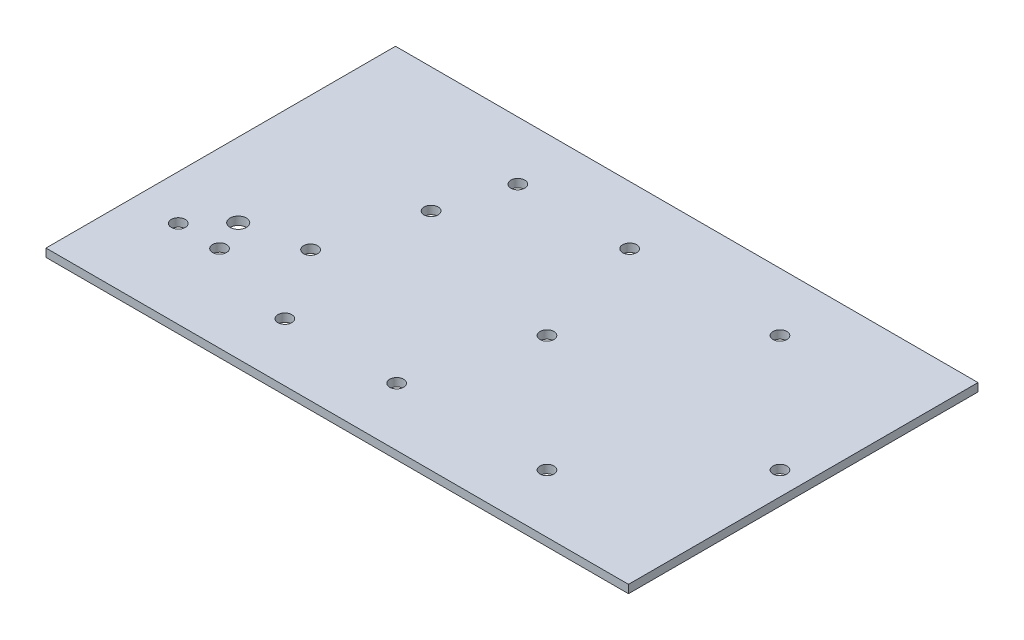
ISO-10303-21;
HEADER;
FILE_DESCRIPTION(('STEP AP214'),'2;1');
FILE_NAME('part.step','',(''),(''),'','','');
FILE_SCHEMA(('AUTOMOTIVE_DESIGN { 1 0 10303 214 1 1 1 1 }'));
ENDSEC;
DATA;
#1=APPLICATION_CONTEXT('core data for automotive mechanical design processes');
#2=APPLICATION_PROTOCOL_DEFINITION('international standard','automotive_design',2000,#1);
#3=PRODUCT_CONTEXT('',#1,'mechanical');
#4=PRODUCT('Part','Part','',(#3));
#5=PRODUCT_RELATED_PRODUCT_CATEGORY('part','',(#4));
#6=PRODUCT_DEFINITION_FORMATION('','',#4);
#7=PRODUCT_DEFINITION_CONTEXT('part definition',#1,'design');
#8=PRODUCT_DEFINITION('design','',#6,#7);
#9=PRODUCT_DEFINITION_SHAPE('','',#8);
#10=(LENGTH_UNIT() NAMED_UNIT(*) SI_UNIT(.MILLI.,.METRE.));
#11=(NAMED_UNIT(*) PLANE_ANGLE_UNIT() SI_UNIT($,.RADIAN.));
#12=(NAMED_UNIT(*) SI_UNIT($,.STERADIAN.) SOLID_ANGLE_UNIT());
#13=UNCERTAINTY_MEASURE_WITH_UNIT(LENGTH_MEASURE(1.E-05),#10,'distance_accuracy_value','');
#14=(GEOMETRIC_REPRESENTATION_CONTEXT(3) GLOBAL_UNCERTAINTY_ASSIGNED_CONTEXT((#13)) GLOBAL_UNIT_ASSIGNED_CONTEXT((#10,
#11,#12)) REPRESENTATION_CONTEXT('',''));
#15=CARTESIAN_POINT('',(0.,0.,0.));
#16=DIRECTION('',(0.,0.,1.));
#17=DIRECTION('',(1.,0.,0.));
#18=AXIS2_PLACEMENT_3D('',#15,#16,#17);
#19=CARTESIAN_POINT('',(-190.,-5.,-75.));
#20=DIRECTION('',(-1.,0.,0.));
#21=DIRECTION('',(0.,0.,1.));
#22=AXIS2_PLACEMENT_3D('',#19,#20,#21);
#23=PLANE('',#22);
#24=DIRECTION('',(0.,1.,0.));
#25=VECTOR('',#24,1.);
#26=CARTESIAN_POINT('',(-190.,-5.,75.));
#27=LINE('',#26,#25);
#28=CARTESIAN_POINT('',(-190.,-5.,75.));
#29=VERTEX_POINT('',#28);
#30=CARTESIAN_POINT('',(-190.,-1.5,75.));
#31=VERTEX_POINT('',#30);
#32=EDGE_CURVE('E38',#29,#31,#27,.T.);
#33=ORIENTED_EDGE('',*,*,#32,.T.);
#34=DIRECTION('',(0.,0.,1.));
#35=VECTOR('',#34,1.);
#36=CARTESIAN_POINT('',(-190.,-1.5,-75.));
#37=LINE('',#36,#35);
#38=CARTESIAN_POINT('',(-190.,-1.5,-75.));
#39=VERTEX_POINT('',#38);
#40=EDGE_CURVE('E51',#39,#31,#37,.T.);
#41=ORIENTED_EDGE('',*,*,#40,.F.);
#42=DIRECTION('',(0.,1.,0.));
#43=VECTOR('',#42,1.);
#44=CARTESIAN_POINT('',(-190.,-5.,-75.));
#45=LINE('',#44,#43);
#46=CARTESIAN_POINT('',(-190.,-5.,-75.));
#47=VERTEX_POINT('',#46);
#48=EDGE_CURVE('E11',#47,#39,#45,.T.);
#49=ORIENTED_EDGE('',*,*,#48,.F.);
#50=DIRECTION('',(0.,0.,1.));
#51=VECTOR('',#50,1.);
#52=CARTESIAN_POINT('',(-190.,-5.,-75.));
#53=LINE('',#52,#51);
#54=EDGE_CURVE('E94',#47,#29,#53,.T.);
#55=ORIENTED_EDGE('',*,*,#54,.T.);
#56=EDGE_LOOP('',(#33,#41,#49,#55));
#57=FACE_BOUND('',#56,.T.);
#58=ADVANCED_FACE('F35',(#57),#23,.T.);
#59=CARTESIAN_POINT('',(-190.,-5.,-75.));
#60=DIRECTION('',(0.,0.,1.));
#61=DIRECTION('',(1.,0.,0.));
#62=AXIS2_PLACEMENT_3D('',#59,#60,#61);
#63=PLANE('',#62);
#64=DIRECTION('',(-1.,0.,0.));
#65=VECTOR('',#64,1.);
#66=CARTESIAN_POINT('',(60.,-1.5,-75.));
#67=LINE('',#66,#65);
#68=CARTESIAN_POINT('',(60.,-1.5,-75.));
#69=VERTEX_POINT('',#68);
#70=EDGE_CURVE('E74',#69,#39,#67,.T.);
#71=ORIENTED_EDGE('',*,*,#70,.F.);
#72=DIRECTION('',(0.,1.,0.));
#73=VECTOR('',#72,1.);
#74=CARTESIAN_POINT('',(60.,-5.,-75.));
#75=LINE('',#74,#73);
#76=CARTESIAN_POINT('',(60.,-5.,-75.));
#77=VERTEX_POINT('',#76);
#78=EDGE_CURVE('E43',#77,#69,#75,.T.);
#79=ORIENTED_EDGE('',*,*,#78,.F.);
#80=DIRECTION('',(1.,0.,0.));
#81=VECTOR('',#80,1.);
#82=CARTESIAN_POINT('',(-190.,-5.,-75.));
#83=LINE('',#82,#81);
#84=EDGE_CURVE('E87',#47,#77,#83,.T.);
#85=ORIENTED_EDGE('',*,*,#84,.F.);
#86=ORIENTED_EDGE('',*,*,#48,.T.);
#87=EDGE_LOOP('',(#71,#79,#85,#86));
#88=FACE_BOUND('',#87,.T.);
#89=ADVANCED_FACE('F86',(#88),#63,.F.);
#90=CARTESIAN_POINT('',(60.,-5.,-75.));
#91=DIRECTION('',(-1.,0.,0.));
#92=DIRECTION('',(0.,0.,1.));
#93=AXIS2_PLACEMENT_3D('',#90,#91,#92);
#94=PLANE('',#93);
#95=DIRECTION('',(0.,0.,-1.));
#96=VECTOR('',#95,1.);
#97=CARTESIAN_POINT('',(60.,-1.5,75.));
#98=LINE('',#97,#96);
#99=CARTESIAN_POINT('',(60.,-1.5,75.));
#100=VERTEX_POINT('',#99);
#101=EDGE_CURVE('E77',#100,#69,#98,.T.);
#102=ORIENTED_EDGE('',*,*,#101,.F.);
#103=DIRECTION('',(0.,1.,0.));
#104=VECTOR('',#103,1.);
#105=CARTESIAN_POINT('',(60.,-5.,75.));
#106=LINE('',#105,#104);
#107=CARTESIAN_POINT('',(60.,-5.,75.));
#108=VERTEX_POINT('',#107);
#109=EDGE_CURVE('E107',#108,#100,#106,.T.);
#110=ORIENTED_EDGE('',*,*,#109,.F.);
#111=DIRECTION('',(0.,0.,1.));
#112=VECTOR('',#111,1.);
#113=CARTESIAN_POINT('',(60.,-5.,-75.));
#114=LINE('',#113,#112);
#115=EDGE_CURVE('E91',#77,#108,#114,.T.);
#116=ORIENTED_EDGE('',*,*,#115,.F.);
#117=ORIENTED_EDGE('',*,*,#78,.T.);
#118=EDGE_LOOP('',(#102,#110,#116,#117));
#119=FACE_BOUND('',#118,.T.);
#120=ADVANCED_FACE('F113',(#119),#94,.F.);
#121=CARTESIAN_POINT('',(-190.,-5.,75.));
#122=DIRECTION('',(0.,0.,1.));
#123=DIRECTION('',(1.,0.,0.));
#124=AXIS2_PLACEMENT_3D('',#121,#122,#123);
#125=PLANE('',#124);
#126=ORIENTED_EDGE('',*,*,#109,.T.);
#127=DIRECTION('',(1.,0.,0.));
#128=VECTOR('',#127,1.);
#129=CARTESIAN_POINT('',(-190.,-1.5,75.));
#130=LINE('',#129,#128);
#131=EDGE_CURVE('E84',#31,#100,#130,.T.);
#132=ORIENTED_EDGE('',*,*,#131,.F.);
#133=ORIENTED_EDGE('',*,*,#32,.F.);
#134=DIRECTION('',(1.,0.,0.));
#135=VECTOR('',#134,1.);
#136=CARTESIAN_POINT('',(-190.,-5.,75.));
#137=LINE('',#136,#135);
#138=EDGE_CURVE('E97',#29,#108,#137,.T.);
#139=ORIENTED_EDGE('',*,*,#138,.T.);
#140=EDGE_LOOP('',(#126,#132,#133,#139));
#141=FACE_BOUND('',#140,.T.);
#142=ADVANCED_FACE('F111',(#141),#125,.T.);
#143=CARTESIAN_POINT('',(0.,-5.,-50.));
#144=DIRECTION('',(0.,1.,0.));
#145=DIRECTION('',(0.,0.,1.));
#146=AXIS2_PLACEMENT_3D('',#143,#144,#145);
#147=CYLINDRICAL_SURFACE('',#146,3.);
#148=CARTESIAN_POINT('',(0.,-5.,-50.));
#149=DIRECTION('',(0.,1.,0.));
#150=DIRECTION('',(0.,0.,1.));
#151=AXIS2_PLACEMENT_3D('',#148,#149,#150);
#152=CIRCLE('',#151,3.);
#153=CARTESIAN_POINT('',(0.,-5.,-47.));
#154=VERTEX_POINT('',#153);
#155=EDGE_CURVE('E98',#154,#154,#152,.T.);
#156=ORIENTED_EDGE('',*,*,#155,.F.);
#157=EDGE_LOOP('',(#156));
#158=FACE_BOUND('',#157,.T.);
#159=CARTESIAN_POINT('',(0.,-1.5,-50.));
#160=DIRECTION('',(0.,1.,0.));
#161=DIRECTION('',(0.,0.,1.));
#162=AXIS2_PLACEMENT_3D('',#159,#160,#161);
#163=CIRCLE('',#162,3.);
#164=CARTESIAN_POINT('',(0.,-1.5,-47.));
#165=VERTEX_POINT('',#164);
#166=EDGE_CURVE('E165',#165,#165,#163,.T.);
#167=ORIENTED_EDGE('',*,*,#166,.T.);
#168=EDGE_LOOP('',(#167));
#169=FACE_BOUND('',#168,.T.);
#170=ADVANCED_FACE('F152',(#158,#169),#147,.F.);
#171=CARTESIAN_POINT('',(-50.,-5.,0.));
#172=DIRECTION('',(0.,1.,0.));
#173=DIRECTION('',(0.,0.,1.));
#174=AXIS2_PLACEMENT_3D('',#171,#172,#173);
#175=CYLINDRICAL_SURFACE('',#174,3.);
#176=CARTESIAN_POINT('',(-50.,-5.,0.));
#177=DIRECTION('',(0.,1.,0.));
#178=DIRECTION('',(0.,0.,1.));
#179=AXIS2_PLACEMENT_3D('',#176,#177,#178);
#180=CIRCLE('',#179,3.);
#181=CARTESIAN_POINT('',(-50.,-5.,3.));
#182=VERTEX_POINT('',#181);
#183=EDGE_CURVE('E102',#182,#182,#180,.T.);
#184=ORIENTED_EDGE('',*,*,#183,.F.);
#185=EDGE_LOOP('',(#184));
#186=FACE_BOUND('',#185,.T.);
#187=CARTESIAN_POINT('',(-50.,-1.5,0.));
#188=DIRECTION('',(0.,1.,0.));
#189=DIRECTION('',(0.,0.,1.));
#190=AXIS2_PLACEMENT_3D('',#187,#188,#189);
#191=CIRCLE('',#190,3.);
#192=CARTESIAN_POINT('',(-50.,-1.5,3.));
#193=VERTEX_POINT('',#192);
#194=EDGE_CURVE('E156',#193,#193,#191,.T.);
#195=ORIENTED_EDGE('',*,*,#194,.T.);
#196=EDGE_LOOP('',(#195));
#197=FACE_BOUND('',#196,.T.);
#198=ADVANCED_FACE('F148',(#186,#197),#175,.F.);
#199=CARTESIAN_POINT('',(0.,-5.,50.));
#200=DIRECTION('',(0.,1.,0.));
#201=DIRECTION('',(0.,0.,1.));
#202=AXIS2_PLACEMENT_3D('',#199,#200,#201);
#203=CYLINDRICAL_SURFACE('',#202,3.);
#204=CARTESIAN_POINT('',(0.,-5.,50.));
#205=DIRECTION('',(0.,1.,0.));
#206=DIRECTION('',(0.,0.,1.));
#207=AXIS2_PLACEMENT_3D('',#204,#205,#206);
#208=CIRCLE('',#207,3.);
#209=CARTESIAN_POINT('',(0.,-5.,53.));
#210=VERTEX_POINT('',#209);
#211=EDGE_CURVE('E141',#210,#210,#208,.T.);
#212=ORIENTED_EDGE('',*,*,#211,.F.);
#213=EDGE_LOOP('',(#212));
#214=FACE_BOUND('',#213,.T.);
#215=CARTESIAN_POINT('',(0.,-1.5,50.));
#216=DIRECTION('',(0.,1.,0.));
#217=DIRECTION('',(0.,0.,1.));
#218=AXIS2_PLACEMENT_3D('',#215,#216,#217);
#219=CIRCLE('',#218,3.);
#220=CARTESIAN_POINT('',(0.,-1.5,53.));
#221=VERTEX_POINT('',#220);
#222=EDGE_CURVE('E291',#221,#221,#219,.T.);
#223=ORIENTED_EDGE('',*,*,#222,.T.);
#224=EDGE_LOOP('',(#223));
#225=FACE_BOUND('',#224,.T.);
#226=ADVANCED_FACE('F151',(#214,#225),#203,.F.);
#227=CARTESIAN_POINT('',(50.,-5.,0.));
#228=DIRECTION('',(0.,1.,0.));
#229=DIRECTION('',(0.,0.,1.));
#230=AXIS2_PLACEMENT_3D('',#227,#228,#229);
#231=CYLINDRICAL_SURFACE('',#230,3.);
#232=CARTESIAN_POINT('',(50.,-5.,0.));
#233=DIRECTION('',(0.,1.,0.));
#234=DIRECTION('',(0.,0.,1.));
#235=AXIS2_PLACEMENT_3D('',#232,#233,#234);
#236=CIRCLE('',#235,3.);
#237=CARTESIAN_POINT('',(50.,-5.,3.));
#238=VERTEX_POINT('',#237);
#239=EDGE_CURVE('E138',#238,#238,#236,.T.);
#240=ORIENTED_EDGE('',*,*,#239,.F.);
#241=EDGE_LOOP('',(#240));
#242=FACE_BOUND('',#241,.T.);
#243=CARTESIAN_POINT('',(50.,-1.5,0.));
#244=DIRECTION('',(0.,1.,0.));
#245=DIRECTION('',(0.,0.,1.));
#246=AXIS2_PLACEMENT_3D('',#243,#244,#245);
#247=CIRCLE('',#246,3.);
#248=CARTESIAN_POINT('',(50.,-1.5,3.));
#249=VERTEX_POINT('',#248);
#250=EDGE_CURVE('E293',#249,#249,#247,.T.);
#251=ORIENTED_EDGE('',*,*,#250,.T.);
#252=EDGE_LOOP('',(#251));
#253=FACE_BOUND('',#252,.T.);
#254=ADVANCED_FACE('F224',(#242,#253),#231,.F.);
#255=CARTESIAN_POINT('',(-170.76,-5.,37.46));
#256=DIRECTION('',(0.,1.,0.));
#257=DIRECTION('',(0.,0.,1.));
#258=AXIS2_PLACEMENT_3D('',#255,#256,#257);
#259=CYLINDRICAL_SURFACE('',#258,2.99999999999999);
#260=CARTESIAN_POINT('',(-170.76,-5.,37.46));
#261=DIRECTION('',(0.,1.,0.));
#262=DIRECTION('',(0.,0.,1.));
#263=AXIS2_PLACEMENT_3D('',#260,#261,#262);
#264=CIRCLE('',#263,2.99999999999999);
#265=CARTESIAN_POINT('',(-170.76,-5.,40.46));
#266=VERTEX_POINT('',#265);
#267=EDGE_CURVE('E135',#266,#266,#264,.T.);
#268=ORIENTED_EDGE('',*,*,#267,.F.);
#269=EDGE_LOOP('',(#268));
#270=FACE_BOUND('',#269,.T.);
#271=CARTESIAN_POINT('',(-170.76,-1.5,37.46));
#272=DIRECTION('',(0.,1.,0.));
#273=DIRECTION('',(0.,0.,1.));
#274=AXIS2_PLACEMENT_3D('',#271,#272,#273);
#275=CIRCLE('',#274,2.99999999999999);
#276=CARTESIAN_POINT('',(-170.76,-1.5,40.46));
#277=VERTEX_POINT('',#276);
#278=EDGE_CURVE('E81',#277,#277,#275,.T.);
#279=ORIENTED_EDGE('',*,*,#278,.T.);
#280=EDGE_LOOP('',(#279));
#281=FACE_BOUND('',#280,.T.);
#282=ADVANCED_FACE('F183',(#270,#281),#259,.F.);
#283=CARTESIAN_POINT('',(-152.57,-45.,37.93));
#284=DIRECTION('',(0.,1.,0.));
#285=DIRECTION('',(0.,0.,1.));
#286=AXIS2_PLACEMENT_3D('',#283,#284,#285);
#287=CYLINDRICAL_SURFACE('',#286,2.99999999999999);
#288=CARTESIAN_POINT('',(-152.57,-5.,37.93));
#289=DIRECTION('',(0.,1.,0.));
#290=DIRECTION('',(0.,0.,1.));
#291=AXIS2_PLACEMENT_3D('',#288,#289,#290);
#292=CIRCLE('',#291,2.99999999999999);
#293=CARTESIAN_POINT('',(-152.57,-5.,40.93));
#294=VERTEX_POINT('',#293);
#295=EDGE_CURVE('E132',#294,#294,#292,.T.);
#296=ORIENTED_EDGE('',*,*,#295,.F.);
#297=EDGE_LOOP('',(#296));
#298=FACE_BOUND('',#297,.T.);
#299=CARTESIAN_POINT('',(-152.57,-1.5,37.93));
#300=DIRECTION('',(0.,1.,0.));
#301=DIRECTION('',(0.,0.,1.));
#302=AXIS2_PLACEMENT_3D('',#299,#300,#301);
#303=CIRCLE('',#302,2.99999999999999);
#304=CARTESIAN_POINT('',(-152.57,-1.5,40.93));
#305=VERTEX_POINT('',#304);
#306=EDGE_CURVE('E174',#305,#305,#303,.T.);
#307=ORIENTED_EDGE('',*,*,#306,.T.);
#308=EDGE_LOOP('',(#307));
#309=FACE_BOUND('',#308,.T.);
#310=ADVANCED_FACE('F231',(#298,#309),#287,.F.);
#311=CARTESIAN_POINT('',(-158.16,-45.,24.34));
#312=DIRECTION('',(0.,1.,0.));
#313=DIRECTION('',(0.,0.,1.));
#314=AXIS2_PLACEMENT_3D('',#311,#312,#313);
#315=CYLINDRICAL_SURFACE('',#314,3.49999999999999);
#316=CARTESIAN_POINT('',(-158.16,-5.,24.34));
#317=DIRECTION('',(0.,1.,0.));
#318=DIRECTION('',(0.,0.,1.));
#319=AXIS2_PLACEMENT_3D('',#316,#317,#318);
#320=CIRCLE('',#319,3.49999999999999);
#321=CARTESIAN_POINT('',(-158.16,-5.,27.84));
#322=VERTEX_POINT('',#321);
#323=EDGE_CURVE('E129',#322,#322,#320,.T.);
#324=ORIENTED_EDGE('',*,*,#323,.F.);
#325=EDGE_LOOP('',(#324));
#326=FACE_BOUND('',#325,.T.);
#327=CARTESIAN_POINT('',(-158.16,-1.5,24.34));
#328=DIRECTION('',(0.,1.,0.));
#329=DIRECTION('',(0.,0.,1.));
#330=AXIS2_PLACEMENT_3D('',#327,#328,#329);
#331=CIRCLE('',#330,3.49999999999999);
#332=CARTESIAN_POINT('',(-158.16,-1.5,27.84));
#333=VERTEX_POINT('',#332);
#334=EDGE_CURVE('E177',#333,#333,#331,.T.);
#335=ORIENTED_EDGE('',*,*,#334,.T.);
#336=EDGE_LOOP('',(#335));
#337=FACE_BOUND('',#336,.T.);
#338=ADVANCED_FACE('F235',(#326,#337),#315,.F.);
#339=CARTESIAN_POINT('',(-112.5,-5.,50.));
#340=DIRECTION('',(0.,1.,0.));
#341=DIRECTION('',(0.,0.,1.));
#342=AXIS2_PLACEMENT_3D('',#339,#340,#341);
#343=CYLINDRICAL_SURFACE('',#342,3.00000000000001);
#344=CARTESIAN_POINT('',(-112.5,-5.,50.));
#345=DIRECTION('',(0.,1.,0.));
#346=DIRECTION('',(0.,0.,1.));
#347=AXIS2_PLACEMENT_3D('',#344,#345,#346);
#348=CIRCLE('',#347,3.00000000000001);
#349=CARTESIAN_POINT('',(-112.5,-5.,53.));
#350=VERTEX_POINT('',#349);
#351=EDGE_CURVE('E126',#350,#350,#348,.T.);
#352=ORIENTED_EDGE('',*,*,#351,.F.);
#353=EDGE_LOOP('',(#352));
#354=FACE_BOUND('',#353,.T.);
#355=CARTESIAN_POINT('',(-112.5,-1.5,50.));
#356=DIRECTION('',(0.,1.,0.));
#357=DIRECTION('',(0.,0.,1.));
#358=AXIS2_PLACEMENT_3D('',#355,#356,#357);
#359=CIRCLE('',#358,3.00000000000001);
#360=CARTESIAN_POINT('',(-112.5,-1.5,53.));
#361=VERTEX_POINT('',#360);
#362=EDGE_CURVE('E162',#361,#361,#359,.T.);
#363=ORIENTED_EDGE('',*,*,#362,.T.);
#364=EDGE_LOOP('',(#363));
#365=FACE_BOUND('',#364,.T.);
#366=ADVANCED_FACE('F239',(#354,#365),#343,.F.);
#367=CARTESIAN_POINT('',(-64.5,-5.,50.));
#368=DIRECTION('',(0.,1.,0.));
#369=DIRECTION('',(0.,0.,1.));
#370=AXIS2_PLACEMENT_3D('',#367,#368,#369);
#371=CYLINDRICAL_SURFACE('',#370,3.);
#372=CARTESIAN_POINT('',(-64.5,-5.,50.));
#373=DIRECTION('',(0.,1.,0.));
#374=DIRECTION('',(0.,0.,1.));
#375=AXIS2_PLACEMENT_3D('',#372,#373,#374);
#376=CIRCLE('',#375,3.);
#377=CARTESIAN_POINT('',(-64.5,-5.,53.));
#378=VERTEX_POINT('',#377);
#379=EDGE_CURVE('E123',#378,#378,#376,.T.);
#380=ORIENTED_EDGE('',*,*,#379,.F.);
#381=EDGE_LOOP('',(#380));
#382=FACE_BOUND('',#381,.T.);
#383=CARTESIAN_POINT('',(-64.5,-1.5,50.));
#384=DIRECTION('',(0.,1.,0.));
#385=DIRECTION('',(0.,0.,1.));
#386=AXIS2_PLACEMENT_3D('',#383,#384,#385);
#387=CIRCLE('',#386,3.);
#388=CARTESIAN_POINT('',(-64.5,-1.5,53.));
#389=VERTEX_POINT('',#388);
#390=EDGE_CURVE('E159',#389,#389,#387,.T.);
#391=ORIENTED_EDGE('',*,*,#390,.T.);
#392=EDGE_LOOP('',(#391));
#393=FACE_BOUND('',#392,.T.);
#394=ADVANCED_FACE('F243',(#382,#393),#371,.F.);
#395=CARTESIAN_POINT('',(-132.61,-5.,18.84));
#396=DIRECTION('',(0.,1.,0.));
#397=DIRECTION('',(0.,0.,1.));
#398=AXIS2_PLACEMENT_3D('',#395,#396,#397);
#399=CYLINDRICAL_SURFACE('',#398,2.99999999999999);
#400=CARTESIAN_POINT('',(-132.61,-5.,18.84));
#401=DIRECTION('',(0.,1.,0.));
#402=DIRECTION('',(0.,0.,1.));
#403=AXIS2_PLACEMENT_3D('',#400,#401,#402);
#404=CIRCLE('',#403,2.99999999999999);
#405=CARTESIAN_POINT('',(-132.61,-5.,21.84));
#406=VERTEX_POINT('',#405);
#407=EDGE_CURVE('E117',#406,#406,#404,.T.);
#408=ORIENTED_EDGE('',*,*,#407,.F.);
#409=EDGE_LOOP('',(#408));
#410=FACE_BOUND('',#409,.T.);
#411=CARTESIAN_POINT('',(-132.61,-1.5,18.84));
#412=DIRECTION('',(0.,1.,0.));
#413=DIRECTION('',(0.,0.,1.));
#414=AXIS2_PLACEMENT_3D('',#411,#412,#413);
#415=CIRCLE('',#414,2.99999999999999);
#416=CARTESIAN_POINT('',(-132.61,-1.5,21.84));
#417=VERTEX_POINT('',#416);
#418=EDGE_CURVE('E171',#417,#417,#415,.T.);
#419=ORIENTED_EDGE('',*,*,#418,.T.);
#420=EDGE_LOOP('',(#419));
#421=FACE_BOUND('',#420,.T.);
#422=ADVANCED_FACE('F247',(#410,#421),#399,.F.);
#423=CARTESIAN_POINT('',(-121.14,-5.,-21.42));
#424=DIRECTION('',(0.,1.,0.));
#425=DIRECTION('',(0.,0.,1.));
#426=AXIS2_PLACEMENT_3D('',#423,#424,#425);
#427=CYLINDRICAL_SURFACE('',#426,3.00000000000001);
#428=CARTESIAN_POINT('',(-121.14,-5.,-21.42));
#429=DIRECTION('',(0.,1.,0.));
#430=DIRECTION('',(0.,0.,1.));
#431=AXIS2_PLACEMENT_3D('',#428,#429,#430);
#432=CIRCLE('',#431,3.00000000000001);
#433=CARTESIAN_POINT('',(-121.14,-5.,-18.42));
#434=VERTEX_POINT('',#433);
#435=EDGE_CURVE('E114',#434,#434,#432,.T.);
#436=ORIENTED_EDGE('',*,*,#435,.F.);
#437=EDGE_LOOP('',(#436));
#438=FACE_BOUND('',#437,.T.);
#439=CARTESIAN_POINT('',(-121.14,-1.5,-21.42));
#440=DIRECTION('',(0.,1.,0.));
#441=DIRECTION('',(0.,0.,1.));
#442=AXIS2_PLACEMENT_3D('',#439,#440,#441);
#443=CIRCLE('',#442,3.00000000000001);
#444=CARTESIAN_POINT('',(-121.14,-1.5,-18.42));
#445=VERTEX_POINT('',#444);
#446=EDGE_CURVE('E158',#445,#445,#443,.T.);
#447=ORIENTED_EDGE('',*,*,#446,.T.);
#448=EDGE_LOOP('',(#447));
#449=FACE_BOUND('',#448,.T.);
#450=ADVANCED_FACE('F196',(#438,#449),#427,.F.);
#451=CARTESIAN_POINT('',(0.,-5.,0.));
#452=DIRECTION('',(0.,1.,0.));
#453=DIRECTION('',(0.,0.,1.));
#454=AXIS2_PLACEMENT_3D('',#451,#452,#453);
#455=PLANE('',#454);
#456=CARTESIAN_POINT('',(-112.5,-5.,-50.));
#457=DIRECTION('',(0.,1.,0.));
#458=DIRECTION('',(0.,0.,1.));
#459=AXIS2_PLACEMENT_3D('',#456,#457,#458);
#460=CIRCLE('',#459,3.00000000000001);
#461=CARTESIAN_POINT('',(-112.5,-5.,-47.));
#462=VERTEX_POINT('',#461);
#463=EDGE_CURVE('E303',#462,#462,#460,.T.);
#464=ORIENTED_EDGE('',*,*,#463,.T.);
#465=EDGE_LOOP('',(#464));
#466=FACE_BOUND('',#465,.T.);
#467=CARTESIAN_POINT('',(-64.5,-5.,-50.));
#468=DIRECTION('',(0.,1.,0.));
#469=DIRECTION('',(0.,0.,1.));
#470=AXIS2_PLACEMENT_3D('',#467,#468,#469);
#471=CIRCLE('',#470,3.);
#472=CARTESIAN_POINT('',(-64.5,-5.,-47.));
#473=VERTEX_POINT('',#472);
#474=EDGE_CURVE('E297',#473,#473,#471,.T.);
#475=ORIENTED_EDGE('',*,*,#474,.T.);
#476=EDGE_LOOP('',(#475));
#477=FACE_BOUND('',#476,.T.);
#478=ORIENTED_EDGE('',*,*,#435,.T.);
#479=EDGE_LOOP('',(#478));
#480=FACE_BOUND('',#479,.T.);
#481=ORIENTED_EDGE('',*,*,#407,.T.);
#482=EDGE_LOOP('',(#481));
#483=FACE_BOUND('',#482,.T.);
#484=ORIENTED_EDGE('',*,*,#379,.T.);
#485=EDGE_LOOP('',(#484));
#486=FACE_BOUND('',#485,.T.);
#487=ORIENTED_EDGE('',*,*,#351,.T.);
#488=EDGE_LOOP('',(#487));
#489=FACE_BOUND('',#488,.T.);
#490=ORIENTED_EDGE('',*,*,#323,.T.);
#491=EDGE_LOOP('',(#490));
#492=FACE_BOUND('',#491,.T.);
#493=ORIENTED_EDGE('',*,*,#295,.T.);
#494=EDGE_LOOP('',(#493));
#495=FACE_BOUND('',#494,.T.);
#496=ORIENTED_EDGE('',*,*,#267,.T.);
#497=EDGE_LOOP('',(#496));
#498=FACE_BOUND('',#497,.T.);
#499=ORIENTED_EDGE('',*,*,#239,.T.);
#500=EDGE_LOOP('',(#499));
#501=FACE_BOUND('',#500,.T.);
#502=ORIENTED_EDGE('',*,*,#211,.T.);
#503=EDGE_LOOP('',(#502));
#504=FACE_BOUND('',#503,.T.);
#505=ORIENTED_EDGE('',*,*,#183,.T.);
#506=EDGE_LOOP('',(#505));
#507=FACE_BOUND('',#506,.T.);
#508=ORIENTED_EDGE('',*,*,#155,.T.);
#509=EDGE_LOOP('',(#508));
#510=FACE_BOUND('',#509,.T.);
#511=ORIENTED_EDGE('',*,*,#54,.F.);
#512=ORIENTED_EDGE('',*,*,#84,.T.);
#513=ORIENTED_EDGE('',*,*,#115,.T.);
#514=ORIENTED_EDGE('',*,*,#138,.F.);
#515=EDGE_LOOP('',(#511,#512,#513,#514));
#516=FACE_BOUND('',#515,.T.);
#517=ADVANCED_FACE('F95',(#466,#477,#480,#483,#486,#489,#492,#495,#498,#501,#504,#507,#510,
#516),#455,.F.);
#518=CARTESIAN_POINT('',(0.,-1.5,0.));
#519=DIRECTION('',(0.,1.,0.));
#520=DIRECTION('',(0.,0.,1.));
#521=AXIS2_PLACEMENT_3D('',#518,#519,#520);
#522=PLANE('',#521);
#523=CARTESIAN_POINT('',(-112.5,-1.5,-50.));
#524=DIRECTION('',(0.,1.,0.));
#525=DIRECTION('',(0.,0.,1.));
#526=AXIS2_PLACEMENT_3D('',#523,#524,#525);
#527=CIRCLE('',#526,3.00000000000001);
#528=CARTESIAN_POINT('',(-112.5,-1.5,-47.));
#529=VERTEX_POINT('',#528);
#530=EDGE_CURVE('E306',#529,#529,#527,.T.);
#531=ORIENTED_EDGE('',*,*,#530,.F.);
#532=EDGE_LOOP('',(#531));
#533=FACE_BOUND('',#532,.T.);
#534=CARTESIAN_POINT('',(-64.5,-1.5,-50.));
#535=DIRECTION('',(0.,1.,0.));
#536=DIRECTION('',(0.,0.,1.));
#537=AXIS2_PLACEMENT_3D('',#534,#535,#536);
#538=CIRCLE('',#537,3.);
#539=CARTESIAN_POINT('',(-64.5,-1.5,-47.));
#540=VERTEX_POINT('',#539);
#541=EDGE_CURVE('E300',#540,#540,#538,.T.);
#542=ORIENTED_EDGE('',*,*,#541,.F.);
#543=EDGE_LOOP('',(#542));
#544=FACE_BOUND('',#543,.T.);
#545=ORIENTED_EDGE('',*,*,#250,.F.);
#546=EDGE_LOOP('',(#545));
#547=FACE_BOUND('',#546,.T.);
#548=ORIENTED_EDGE('',*,*,#222,.F.);
#549=EDGE_LOOP('',(#548));
#550=FACE_BOUND('',#549,.T.);
#551=ORIENTED_EDGE('',*,*,#166,.F.);
#552=EDGE_LOOP('',(#551));
#553=FACE_BOUND('',#552,.T.);
#554=ORIENTED_EDGE('',*,*,#390,.F.);
#555=EDGE_LOOP('',(#554));
#556=FACE_BOUND('',#555,.T.);
#557=ORIENTED_EDGE('',*,*,#194,.F.);
#558=EDGE_LOOP('',(#557));
#559=FACE_BOUND('',#558,.T.);
#560=ORIENTED_EDGE('',*,*,#446,.F.);
#561=EDGE_LOOP('',(#560));
#562=FACE_BOUND('',#561,.T.);
#563=ORIENTED_EDGE('',*,*,#362,.F.);
#564=EDGE_LOOP('',(#563));
#565=FACE_BOUND('',#564,.T.);
#566=ORIENTED_EDGE('',*,*,#418,.F.);
#567=EDGE_LOOP('',(#566));
#568=FACE_BOUND('',#567,.T.);
#569=ORIENTED_EDGE('',*,*,#306,.F.);
#570=EDGE_LOOP('',(#569));
#571=FACE_BOUND('',#570,.T.);
#572=ORIENTED_EDGE('',*,*,#334,.F.);
#573=EDGE_LOOP('',(#572));
#574=FACE_BOUND('',#573,.T.);
#575=ORIENTED_EDGE('',*,*,#278,.F.);
#576=EDGE_LOOP('',(#575));
#577=FACE_BOUND('',#576,.T.);
#578=ORIENTED_EDGE('',*,*,#70,.T.);
#579=ORIENTED_EDGE('',*,*,#40,.T.);
#580=ORIENTED_EDGE('',*,*,#131,.T.);
#581=ORIENTED_EDGE('',*,*,#101,.T.);
#582=EDGE_LOOP('',(#578,#579,#580,#581));
#583=FACE_BOUND('',#582,.T.);
#584=ADVANCED_FACE('F75',(#533,#544,#547,#550,#553,#556,#559,#562,#565,#568,#571,#574,#577,
#583),#522,.T.);
#585=CARTESIAN_POINT('',(-64.5,-5.,-50.));
#586=DIRECTION('',(0.,1.,0.));
#587=DIRECTION('',(0.,0.,1.));
#588=AXIS2_PLACEMENT_3D('',#585,#586,#587);
#589=CYLINDRICAL_SURFACE('',#588,3.);
#590=ORIENTED_EDGE('',*,*,#474,.F.);
#591=EDGE_LOOP('',(#590));
#592=FACE_BOUND('',#591,.T.);
#593=ORIENTED_EDGE('',*,*,#541,.T.);
#594=EDGE_LOOP('',(#593));
#595=FACE_BOUND('',#594,.T.);
#596=ADVANCED_FACE('F186',(#592,#595),#589,.F.);
#597=CARTESIAN_POINT('',(-112.5,-5.,-50.));
#598=DIRECTION('',(0.,1.,0.));
#599=DIRECTION('',(0.,0.,1.));
#600=AXIS2_PLACEMENT_3D('',#597,#598,#599);
#601=CYLINDRICAL_SURFACE('',#600,3.00000000000001);
#602=ORIENTED_EDGE('',*,*,#463,.F.);
#603=EDGE_LOOP('',(#602));
#604=FACE_BOUND('',#603,.T.);
#605=ORIENTED_EDGE('',*,*,#530,.T.);
#606=EDGE_LOOP('',(#605));
#607=FACE_BOUND('',#606,.T.);
#608=ADVANCED_FACE('F193',(#604,#607),#601,.F.);
#609=CLOSED_SHELL('',(#58,#89,#120,#142,#170,#198,#226,#254,#282,#310,#338,#366,#394,#422,#450,
#517,#584,#596,#608));
#610=MANIFOLD_SOLID_BREP('B2',#609);
#611=ADVANCED_BREP_SHAPE_REPRESENTATION('',(#18,#610),#14);
#612=SHAPE_DEFINITION_REPRESENTATION(#9,#611);
ENDSEC;
END-ISO-10303-21;
